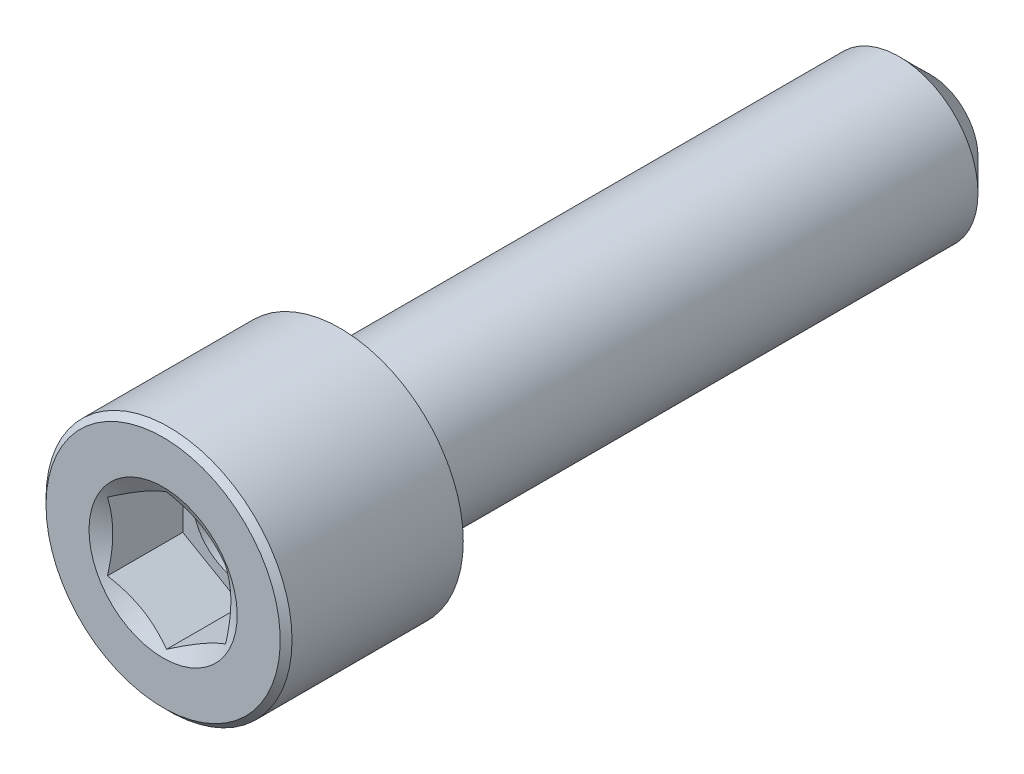
ISO-10303-21;
HEADER;
FILE_DESCRIPTION(('STEP AP214'),'2;1');
FILE_NAME('part.step','',(''),(''),'','','');
FILE_SCHEMA(('AUTOMOTIVE_DESIGN { 1 0 10303 214 1 1 1 1 }'));
ENDSEC;
DATA;
#1=APPLICATION_CONTEXT('core data for automotive mechanical design processes');
#2=APPLICATION_PROTOCOL_DEFINITION('international standard','automotive_design',2000,#1);
#3=PRODUCT_CONTEXT('',#1,'mechanical');
#4=PRODUCT('Part','Part','',(#3));
#5=PRODUCT_RELATED_PRODUCT_CATEGORY('part','',(#4));
#6=PRODUCT_DEFINITION_FORMATION('','',#4);
#7=PRODUCT_DEFINITION_CONTEXT('part definition',#1,'design');
#8=PRODUCT_DEFINITION('design','',#6,#7);
#9=PRODUCT_DEFINITION_SHAPE('','',#8);
#10=(LENGTH_UNIT() NAMED_UNIT(*) SI_UNIT(.MILLI.,.METRE.));
#11=(NAMED_UNIT(*) PLANE_ANGLE_UNIT() SI_UNIT($,.RADIAN.));
#12=(NAMED_UNIT(*) SI_UNIT($,.STERADIAN.) SOLID_ANGLE_UNIT());
#13=UNCERTAINTY_MEASURE_WITH_UNIT(LENGTH_MEASURE(1.E-05),#10,'distance_accuracy_value','');
#14=(GEOMETRIC_REPRESENTATION_CONTEXT(3) GLOBAL_UNCERTAINTY_ASSIGNED_CONTEXT((#13)) GLOBAL_UNIT_ASSIGNED_CONTEXT((#10,
#11,#12)) REPRESENTATION_CONTEXT('',''));
#15=CARTESIAN_POINT('',(0.,0.,0.));
#16=DIRECTION('',(0.,0.,1.));
#17=DIRECTION('',(1.,0.,0.));
#18=AXIS2_PLACEMENT_3D('',#15,#16,#17);
#19=CARTESIAN_POINT('',(0.,0.,-21.7925762462331));
#20=DIRECTION('',(0.,0.,1.));
#21=DIRECTION('',(1.,0.,0.));
#22=AXIS2_PLACEMENT_3D('',#19,#20,#21);
#23=PLANE('',#22);
#24=CARTESIAN_POINT('',(0.,0.,-21.7925762462331));
#25=DIRECTION('',(0.,0.,1.));
#26=DIRECTION('',(1.,0.,0.));
#27=AXIS2_PLACEMENT_3D('',#24,#25,#26);
#28=CIRCLE('',#27,2.4);
#29=CARTESIAN_POINT('',(2.39999999999999,0.,-21.7925762462331));
#30=VERTEX_POINT('',#29);
#31=EDGE_CURVE('E163',#30,#30,#28,.F.);
#32=ORIENTED_EDGE('',*,*,#31,.T.);
#33=EDGE_LOOP('',(#32));
#34=FACE_BOUND('',#33,.T.);
#35=ADVANCED_FACE('F49',(#34),#23,.F.);
#36=CARTESIAN_POINT('',(0.,0.,17.2074237537669));
#37=DIRECTION('',(0.,0.,1.));
#38=DIRECTION('',(1.,0.,0.));
#39=AXIS2_PLACEMENT_3D('',#36,#37,#38);
#40=CYLINDRICAL_SURFACE('',#39,4.);
#41=CARTESIAN_POINT('',(0.,0.,7.70742375376693));
#42=DIRECTION('',(0.,0.,1.));
#43=DIRECTION('',(1.,0.,0.));
#44=AXIS2_PLACEMENT_3D('',#41,#42,#43);
#45=CIRCLE('',#44,4.);
#46=CARTESIAN_POINT('',(4.,0.,7.70742375376693));
#47=VERTEX_POINT('',#46);
#48=EDGE_CURVE('E64',#47,#47,#45,.F.);
#49=ORIENTED_EDGE('',*,*,#48,.T.);
#50=EDGE_LOOP('',(#49));
#51=FACE_BOUND('',#50,.T.);
#52=CARTESIAN_POINT('',(0.,0.,-20.1925762462331));
#53=DIRECTION('',(0.,0.,1.));
#54=DIRECTION('',(1.,0.,0.));
#55=AXIS2_PLACEMENT_3D('',#52,#53,#54);
#56=CIRCLE('',#55,4.);
#57=CARTESIAN_POINT('',(4.,0.,-20.1925762462331));
#58=VERTEX_POINT('',#57);
#59=EDGE_CURVE('E169',#58,#58,#56,.T.);
#60=ORIENTED_EDGE('',*,*,#59,.T.);
#61=EDGE_LOOP('',(#60));
#62=FACE_BOUND('',#61,.T.);
#63=ADVANCED_FACE('F124',(#51,#62),#40,.T.);
#64=CARTESIAN_POINT('',(0.,4.,8.20742375376693));
#65=DIRECTION('',(0.,0.,1.));
#66=DIRECTION('',(1.,0.,0.));
#67=AXIS2_PLACEMENT_3D('',#64,#65,#66);
#68=PLANE('',#67);
#69=CARTESIAN_POINT('',(0.,0.,8.20742375376693));
#70=DIRECTION('',(0.,0.,1.));
#71=DIRECTION('',(1.,0.,0.));
#72=AXIS2_PLACEMENT_3D('',#69,#70,#71);
#73=CIRCLE('',#72,4.5);
#74=CARTESIAN_POINT('',(4.5,0.,8.20742375376693));
#75=VERTEX_POINT('',#74);
#76=EDGE_CURVE('E167',#75,#75,#73,.T.);
#77=ORIENTED_EDGE('',*,*,#76,.T.);
#78=EDGE_LOOP('',(#77));
#79=FACE_BOUND('',#78,.T.);
#80=CARTESIAN_POINT('',(0.,0.,8.20742375376693));
#81=DIRECTION('',(0.,0.,1.));
#82=DIRECTION('',(1.,0.,0.));
#83=AXIS2_PLACEMENT_3D('',#80,#81,#82);
#84=CIRCLE('',#83,6.25);
#85=CARTESIAN_POINT('',(6.25,0.,8.20742375376693));
#86=VERTEX_POINT('',#85);
#87=EDGE_CURVE('E187',#86,#86,#84,.T.);
#88=ORIENTED_EDGE('',*,*,#87,.F.);
#89=EDGE_LOOP('',(#88));
#90=FACE_BOUND('',#89,.T.);
#91=ADVANCED_FACE('F130',(#79,#90),#68,.F.);
#92=CARTESIAN_POINT('',(0.,0.,17.2074237537669));
#93=DIRECTION('',(0.,0.,1.));
#94=DIRECTION('',(1.,0.,0.));
#95=AXIS2_PLACEMENT_3D('',#92,#93,#94);
#96=CYLINDRICAL_SURFACE('',#95,6.25);
#97=CARTESIAN_POINT('',(0.,0.,16.9074237537669));
#98=DIRECTION('',(0.,0.,-1.));
#99=DIRECTION('',(-1.,0.,0.));
#100=AXIS2_PLACEMENT_3D('',#97,#98,#99);
#101=CIRCLE('',#100,6.25);
#102=CARTESIAN_POINT('',(-6.25,0.,16.9074237537669));
#103=VERTEX_POINT('',#102);
#104=EDGE_CURVE('E157',#103,#103,#101,.T.);
#105=ORIENTED_EDGE('',*,*,#104,.T.);
#106=EDGE_LOOP('',(#105));
#107=FACE_BOUND('',#106,.T.);
#108=ORIENTED_EDGE('',*,*,#87,.T.);
#109=EDGE_LOOP('',(#108));
#110=FACE_BOUND('',#109,.T.);
#111=ADVANCED_FACE('F184',(#107,#110),#96,.T.);
#112=CARTESIAN_POINT('',(0.,6.25,17.2074237537669));
#113=DIRECTION('',(0.,0.,-1.));
#114=DIRECTION('',(-1.,0.,0.));
#115=AXIS2_PLACEMENT_3D('',#112,#113,#114);
#116=PLANE('',#115);
#117=CARTESIAN_POINT('',(0.,0.,17.2074237537669));
#118=DIRECTION('',(0.,0.,1.));
#119=DIRECTION('',(0.,-1.,0.));
#120=AXIS2_PLACEMENT_3D('',#117,#118,#119);
#121=CIRCLE('',#120,3.76410161513775);
#122=CARTESIAN_POINT('',(0.,-3.76410161513775,17.2074237537669));
#123=VERTEX_POINT('',#122);
#124=EDGE_CURVE('E321',#123,#123,#121,.T.);
#125=ORIENTED_EDGE('',*,*,#124,.F.);
#126=EDGE_LOOP('',(#125));
#127=FACE_BOUND('',#126,.T.);
#128=CARTESIAN_POINT('',(0.,0.,17.2074237537669));
#129=DIRECTION('',(0.,0.,-1.));
#130=DIRECTION('',(-1.,0.,0.));
#131=AXIS2_PLACEMENT_3D('',#128,#129,#130);
#132=CIRCLE('',#131,5.95);
#133=CARTESIAN_POINT('',(-5.95,0.,17.2074237537669));
#134=VERTEX_POINT('',#133);
#135=EDGE_CURVE('E160',#134,#134,#132,.F.);
#136=ORIENTED_EDGE('',*,*,#135,.T.);
#137=EDGE_LOOP('',(#136));
#138=FACE_BOUND('',#137,.T.);
#139=ADVANCED_FACE('F143',(#127,#138),#116,.F.);
#140=CARTESIAN_POINT('',(0.,0.,-20.1925762462331));
#141=DIRECTION('',(0.,0.,1.));
#142=DIRECTION('',(1.,0.,0.));
#143=AXIS2_PLACEMENT_3D('',#140,#141,#142);
#144=CONICAL_SURFACE('',#143,4.,0.78539816339745);
#145=CARTESIAN_POINT('',(2.39999999999999,0.,-21.7925762462331));
#146=CARTESIAN_POINT('',(2.41666666666666,0.,-21.7759095795664));
#147=CARTESIAN_POINT('',(2.43333333333333,0.,-21.7592429128997));
#148=CARTESIAN_POINT('',(2.46666666666666,0.,-21.7259095795664));
#149=CARTESIAN_POINT('',(2.48333333333333,0.,-21.7092429128997));
#150=CARTESIAN_POINT('',(2.51666666666666,0.,-21.6759095795664));
#151=CARTESIAN_POINT('',(2.53333333333333,0.,-21.6592429128997));
#152=CARTESIAN_POINT('',(2.56666666666666,0.,-21.6259095795664));
#153=CARTESIAN_POINT('',(2.58333333333333,0.,-21.6092429128997));
#154=CARTESIAN_POINT('',(2.61666666666666,0.,-21.5759095795664));
#155=CARTESIAN_POINT('',(2.63333333333333,0.,-21.5592429128997));
#156=CARTESIAN_POINT('',(2.66666666666666,0.,-21.5259095795664));
#157=CARTESIAN_POINT('',(2.68333333333333,0.,-21.5092429128997));
#158=CARTESIAN_POINT('',(2.71666666666666,0.,-21.4759095795664));
#159=CARTESIAN_POINT('',(2.73333333333333,0.,-21.4592429128997));
#160=CARTESIAN_POINT('',(2.76666666666666,0.,-21.4259095795664));
#161=CARTESIAN_POINT('',(2.78333333333333,0.,-21.4092429128997));
#162=CARTESIAN_POINT('',(2.81666666666666,0.,-21.3759095795664));
#163=CARTESIAN_POINT('',(2.83333333333333,0.,-21.3592429128997));
#164=CARTESIAN_POINT('',(2.86666666666666,0.,-21.3259095795664));
#165=CARTESIAN_POINT('',(2.88333333333333,0.,-21.3092429128997));
#166=CARTESIAN_POINT('',(2.91666666666666,0.,-21.2759095795664));
#167=CARTESIAN_POINT('',(2.93333333333333,0.,-21.2592429128997));
#168=CARTESIAN_POINT('',(2.96666666666666,0.,-21.2259095795664));
#169=CARTESIAN_POINT('',(2.98333333333333,0.,-21.2092429128997));
#170=CARTESIAN_POINT('',(3.01666666666666,0.,-21.1759095795664));
#171=CARTESIAN_POINT('',(3.03333333333333,0.,-21.1592429128997));
#172=CARTESIAN_POINT('',(3.06666666666666,0.,-21.1259095795664));
#173=CARTESIAN_POINT('',(3.08333333333333,0.,-21.1092429128997));
#174=CARTESIAN_POINT('',(3.11666666666666,0.,-21.0759095795664));
#175=CARTESIAN_POINT('',(3.13333333333333,0.,-21.0592429128997));
#176=CARTESIAN_POINT('',(3.16666666666666,0.,-21.0259095795664));
#177=CARTESIAN_POINT('',(3.18333333333333,0.,-21.0092429128997));
#178=CARTESIAN_POINT('',(3.21666666666666,0.,-20.9759095795664));
#179=CARTESIAN_POINT('',(3.23333333333333,0.,-20.9592429128997));
#180=CARTESIAN_POINT('',(3.26666666666666,0.,-20.9259095795664));
#181=CARTESIAN_POINT('',(3.28333333333333,0.,-20.9092429128997));
#182=CARTESIAN_POINT('',(3.31666666666666,0.,-20.8759095795664));
#183=CARTESIAN_POINT('',(3.33333333333333,0.,-20.8592429128997));
#184=CARTESIAN_POINT('',(3.36666666666666,0.,-20.8259095795664));
#185=CARTESIAN_POINT('',(3.38333333333333,0.,-20.8092429128997));
#186=CARTESIAN_POINT('',(3.41666666666666,0.,-20.7759095795664));
#187=CARTESIAN_POINT('',(3.43333333333333,0.,-20.7592429128997));
#188=CARTESIAN_POINT('',(3.46666666666666,0.,-20.7259095795664));
#189=CARTESIAN_POINT('',(3.48333333333333,0.,-20.7092429128997));
#190=CARTESIAN_POINT('',(3.51666666666666,0.,-20.6759095795664));
#191=CARTESIAN_POINT('',(3.53333333333333,0.,-20.6592429128997));
#192=CARTESIAN_POINT('',(3.56666666666666,0.,-20.6259095795664));
#193=CARTESIAN_POINT('',(3.58333333333333,0.,-20.6092429128997));
#194=CARTESIAN_POINT('',(3.61666666666666,0.,-20.5759095795664));
#195=CARTESIAN_POINT('',(3.63333333333333,0.,-20.5592429128997));
#196=CARTESIAN_POINT('',(3.66666666666666,0.,-20.5259095795664));
#197=CARTESIAN_POINT('',(3.68333333333333,0.,-20.5092429128997));
#198=CARTESIAN_POINT('',(3.71666666666666,0.,-20.4759095795664));
#199=CARTESIAN_POINT('',(3.73333333333333,0.,-20.4592429128997));
#200=CARTESIAN_POINT('',(3.76666666666666,0.,-20.4259095795664));
#201=CARTESIAN_POINT('',(3.78333333333333,0.,-20.4092429128997));
#202=CARTESIAN_POINT('',(3.81666666666666,0.,-20.3759095795664));
#203=CARTESIAN_POINT('',(3.83333333333333,0.,-20.3592429128997));
#204=CARTESIAN_POINT('',(3.86666666666666,0.,-20.3259095795664));
#205=CARTESIAN_POINT('',(3.88333333333333,0.,-20.3092429128997));
#206=CARTESIAN_POINT('',(3.91666666666666,0.,-20.2759095795664));
#207=CARTESIAN_POINT('',(3.93333333333333,0.,-20.2592429128997));
#208=CARTESIAN_POINT('',(3.96666666666666,0.,-20.2259095795664));
#209=CARTESIAN_POINT('',(3.98333333333333,0.,-20.2092429128997));
#210=CARTESIAN_POINT('',(4.,0.,-20.1925762462331));
#211=B_SPLINE_CURVE_WITH_KNOTS('',3,(#145,#146,#147,#148,#149,#150,#151,#152,#153,#154,#155,
#156,#157,#158,#159,#160,#161,#162,#163,#164,#165,#166,#167,#168,#169,#170,#171,#172,#173,#174,
#175,#176,#177,#178,#179,#180,#181,#182,#183,#184,#185,#186,#187,#188,#189,#190,#191,#192,#193,
#194,#195,#196,#197,#198,#199,#200,#201,#202,#203,#204,#205,#206,#207,#208,#209,#210),
.UNSPECIFIED.,.F.,.F.,(4,2,2,2,2,2,2,2,2,2,2,2,2,2,2,2,2,2,2,2,2,2,2,2,2,2,2,2,2,2,2,2,4),(0.,
0.0707106781186556,0.141421356237311,0.212132034355965,0.282842712474621,0.353553390593274,
0.42426406871193,0.494974746830583,0.565685424949239,0.636396103067895,0.707106781186548,
0.777817459305204,0.848528137423858,0.919238815542513,0.989949493661167,1.06066017177982,
1.13137084989848,1.20208152801713,1.27279220613579,1.34350288425444,1.4142135623731,
1.48492424049175,1.55563491861041,1.62634559672906,1.69705627484772,1.76776695296637,
1.83847763108502,1.90918830920368,1.97989898732233,2.05060966544099,2.12132034355964,
2.1920310216783,2.26274169979696),.UNSPECIFIED.);
#212=EDGE_CURVE('BSEAM137',#30,#58,#211,.T.);
#213=ORIENTED_EDGE('',*,*,#31,.F.);
#214=ORIENTED_EDGE('',*,*,#59,.F.);
#215=ORIENTED_EDGE('',*,*,#212,.T.);
#216=ORIENTED_EDGE('',*,*,#212,.F.);
#217=EDGE_LOOP('',(#213,#215,#214,#216));
#218=FACE_BOUND('',#217,.T.);
#219=ADVANCED_FACE('F137',(#218),#144,.T.);
#220=CARTESIAN_POINT('',(0.,0.,17.2074237537669));
#221=DIRECTION('',(0.,0.,-1.));
#222=DIRECTION('',(-1.,0.,0.));
#223=AXIS2_PLACEMENT_3D('',#220,#221,#222);
#224=CONICAL_SURFACE('',#223,5.95,0.785398163397453);
#225=ORIENTED_EDGE('',*,*,#104,.F.);
#226=EDGE_LOOP('',(#225));
#227=FACE_BOUND('',#226,.T.);
#228=ORIENTED_EDGE('',*,*,#135,.F.);
#229=EDGE_LOOP('',(#228));
#230=FACE_BOUND('',#229,.T.);
#231=ADVANCED_FACE('F142',(#227,#230),#224,.T.);
#232=CARTESIAN_POINT('',(0.,0.,7.70742375376693));
#233=DIRECTION('',(0.,0.,1.));
#234=DIRECTION('',(1.,0.,0.));
#235=AXIS2_PLACEMENT_3D('',#232,#233,#234);
#236=TOROIDAL_SURFACE('',#235,4.5,0.5);
#237=ORIENTED_EDGE('',*,*,#48,.F.);
#238=EDGE_LOOP('',(#237));
#239=FACE_BOUND('',#238,.T.);
#240=ORIENTED_EDGE('',*,*,#76,.F.);
#241=EDGE_LOOP('',(#240));
#242=FACE_BOUND('',#241,.T.);
#243=ADVANCED_FACE('F51',(#239,#242),#236,.F.);
#244=CARTESIAN_POINT('',(0.,0.,16.03421867301));
#245=DIRECTION('',(0.,0.,1.));
#246=DIRECTION('',(0.,-1.,0.));
#247=AXIS2_PLACEMENT_3D('',#244,#245,#246);
#248=CONICAL_SURFACE('',#247,1.73205080756888,1.0471975511966);
#249=ORIENTED_EDGE('',*,*,#124,.T.);
#250=EDGE_LOOP('',(#249));
#251=FACE_BOUND('',#250,.T.);
#252=CARTESIAN_POINT('',(-0.000200000000001688,3.46421708519159,17.0342853430099));
#253=CARTESIAN_POINT('',(0.13163520658833,3.38810199317915,16.9903231850312));
#254=CARTESIAN_POINT('',(0.264608405355248,3.31132988107606,16.9503410668716));
#255=CARTESIAN_POINT('',(0.532857420002055,3.15645624025988,16.8805515610244));
#256=CARTESIAN_POINT('',(0.668138002634341,3.078351959461,16.8507688628443));
#257=CARTESIAN_POINT('',(0.937022602096482,2.92311136358059,16.8044073197902));
#258=CARTESIAN_POINT('',(1.07058524542946,2.84599893549861,16.7875199217019));
#259=CARTESIAN_POINT('',(1.33833905729569,2.6914112001411,16.7673591230274));
#260=CARTESIAN_POINT('',(1.47252925247984,2.61393645482892,16.76406902836));
#261=CARTESIAN_POINT('',(1.72327559769581,2.46916798492017,16.7709100114643));
#262=CARTESIAN_POINT('',(1.83986926497267,2.40185259973206,16.7793613947715));
#263=CARTESIAN_POINT('',(2.07229698497464,2.2676603930218,16.806148423586));
#264=CARTESIAN_POINT('',(2.18813023365133,2.2007840357172,16.8244932214406));
#265=CARTESIAN_POINT('',(2.42103725705637,2.06631510305815,16.8703542314322));
#266=CARTESIAN_POINT('',(2.53808155051394,1.99873954872331,16.898064865842));
#267=CARTESIAN_POINT('',(2.77042435049912,1.86459637060759,16.9609572757163));
#268=CARTESIAN_POINT('',(2.88572583417111,1.79802702797161,16.9961242716005));
#269=CARTESIAN_POINT('',(3.0002,1.73193533751504,17.0342853430099));
#270=B_SPLINE_CURVE_WITH_KNOTS('',3,(#252,#253,#254,#255,#256,#257,#258,#259,#260,#261,#262,
#263,#264,#265,#266,#267,#268,#269),.UNSPECIFIED.,.F.,.F.,(4,2,2,2,2,2,2,2,4),(0.,
0.475539830103042,0.952222784107965,1.41710776961288,1.88142182298026,2.28572436316091,
2.69040156475039,3.10405572063576,3.5168974940707),.UNSPECIFIED.);
#271=CARTESIAN_POINT('',(0.,3.46410161513776,17.03421867301));
#272=VERTEX_POINT('',#271);
#273=CARTESIAN_POINT('',(3.,1.73205080756966,17.0342186730096));
#274=VERTEX_POINT('',#273);
#275=EDGE_CURVE('E240',#272,#274,#270,.T.);
#276=ORIENTED_EDGE('',*,*,#275,.T.);
#277=CARTESIAN_POINT('',(3.,5.38962830538255,18.5954962186005));
#278=CARTESIAN_POINT('',(3.,5.26173740516624,18.5309892800224));
#279=CARTESIAN_POINT('',(3.,5.13363387593006,18.4668996977853));
#280=CARTESIAN_POINT('',(3.,4.8769076841812,18.3397605178634));
#281=CARTESIAN_POINT('',(3.,4.74828500734886,18.2767109491128));
#282=CARTESIAN_POINT('',(3.,4.49018876919909,18.1517420610283));
#283=CARTESIAN_POINT('',(3.,4.36071405549711,18.0898251168979));
#284=CARTESIAN_POINT('',(3.,4.10103827049095,17.9675256649622));
#285=CARTESIAN_POINT('',(3.,3.97083718828899,17.9071431802546));
#286=CARTESIAN_POINT('',(3.,3.7033977456151,17.7854642347925));
#287=CARTESIAN_POINT('',(3.,3.56611756276077,17.7242594026757));
#288=CARTESIAN_POINT('',(3.,3.29041889481005,17.6044723645682));
#289=CARTESIAN_POINT('',(3.,3.15200044707277,17.5458900729064));
#290=CARTESIAN_POINT('',(3.,2.87389204464994,17.4321087038346));
#291=CARTESIAN_POINT('',(3.,2.73420311594281,17.3769071342519));
#292=CARTESIAN_POINT('',(3.,2.45315802907679,17.2707847234612));
#293=CARTESIAN_POINT('',(3.,2.31180143635784,17.2198650274328));
#294=CARTESIAN_POINT('',(3.,1.9967113272517,17.1132592342373));
#295=CARTESIAN_POINT('',(3.,1.82252524878934,17.0588865789683));
#296=CARTESIAN_POINT('',(3.,1.47111129921213,16.9612610161865));
#297=CARTESIAN_POINT('',(3.,1.29388521799238,16.918001789857));
#298=CARTESIAN_POINT('',(3.,0.939484629515729,16.8467367392009));
#299=CARTESIAN_POINT('',(3.,0.762363221635396,16.8184778403726));
#300=CARTESIAN_POINT('',(3.,0.495308220999028,16.7889888122446));
#301=CARTESIAN_POINT('',(3.,0.406065589591795,16.7813090847365));
#302=CARTESIAN_POINT('',(3.,0.227310511889202,16.7704774773063));
#303=CARTESIAN_POINT('',(3.,0.137798102860536,16.7673249983588));
#304=CARTESIAN_POINT('',(3.,-0.0419927126939883,16.7656555197511));
#305=CARTESIAN_POINT('',(3.,-0.132271475241786,16.7671761067044));
#306=CARTESIAN_POINT('',(3.,-0.312623707590833,16.774872795197));
#307=CARTESIAN_POINT('',(3.,-0.402697175799083,16.7810489327389));
#308=CARTESIAN_POINT('',(3.,-0.672336938591248,16.8062866499634));
#309=CARTESIAN_POINT('',(3.,-0.851300421523274,16.8320576642321));
#310=CARTESIAN_POINT('',(3.,-1.20953526816042,16.8991213090178));
#311=CARTESIAN_POINT('',(3.,-1.38875300524909,16.9406877794714));
#312=CARTESIAN_POINT('',(3.,-1.74399100989388,17.0356085310117));
#313=CARTESIAN_POINT('',(3.,-1.92001094125292,17.0889640438509));
#314=CARTESIAN_POINT('',(3.,-2.24046809062631,17.1948825876832));
#315=CARTESIAN_POINT('',(3.,-2.38534606501975,17.2461376137308));
#316=CARTESIAN_POINT('',(3.,-2.67337117238236,17.3533268449299));
#317=CARTESIAN_POINT('',(3.,-2.81651808709219,17.4092616332284));
#318=CARTESIAN_POINT('',(3.,-3.10142959874094,17.524772792179));
#319=CARTESIAN_POINT('',(3.,-3.24319327311719,17.5843514231399));
#320=CARTESIAN_POINT('',(3.,-3.5255059246989,17.7063232732363));
#321=CARTESIAN_POINT('',(3.,-3.66605485700159,17.7687165958908));
#322=CARTESIAN_POINT('',(3.,-3.93966874363035,17.8927823700233));
#323=CARTESIAN_POINT('',(3.,-4.07277923375134,17.9543547395614));
#324=CARTESIAN_POINT('',(3.,-4.33823787201148,18.0791254605474));
#325=CARTESIAN_POINT('',(3.,-4.47058600430111,18.1423238456521));
#326=CARTESIAN_POINT('',(3.,-4.73436013292436,18.2699039922892));
#327=CARTESIAN_POINT('',(3.,-4.8657874960322,18.3342829339957));
#328=CARTESIAN_POINT('',(3.,-5.12809319476855,18.4641284400156));
#329=CARTESIAN_POINT('',(3.,-5.25897156682274,18.529594930693));
#330=CARTESIAN_POINT('',(3.,-5.38962830538255,18.5954962186005));
#331=B_SPLINE_CURVE_WITH_KNOTS('',3,(#277,#278,#279,#280,#281,#282,#283,#284,#285,#286,#287,
#288,#289,#290,#291,#292,#293,#294,#295,#296,#297,#298,#299,#300,#301,#302,#303,#304,#305,#306,
#307,#308,#309,#310,#311,#312,#313,#314,#315,#316,#317,#318,#319,#320,#321,#322,#323,#324,#325,
#326,#327,#328,#329,#330),.UNSPECIFIED.,.F.,.F.,(4,2,2,2,2,2,2,2,2,2,2,2,2,2,2,2,2,2,2,2,2,2,2,
2,2,2,4),(0.,0.429717130035162,0.859446195093511,1.2899917832156,1.72054384832554,
2.17144006765624,2.62232154667326,3.07286654543092,3.52353166094266,4.07067968371202,
4.61751591987665,5.15480687241636,5.42342536576059,5.69200831342277,5.96275717752666,
6.23350813542493,6.77507624835236,7.32649655285842,7.87797449858097,8.3389136666793,
8.79991035838371,9.26119596933361,9.72249855933234,10.1624696483861,10.6024498517182,
11.0414891096709,11.4804987612806),.UNSPECIFIED.);
#332=CARTESIAN_POINT('',(3.,-1.73205080756888,17.03421867301));
#333=VERTEX_POINT('',#332);
#334=EDGE_CURVE('E248',#274,#333,#331,.T.);
#335=ORIENTED_EDGE('',*,*,#334,.T.);
#336=CARTESIAN_POINT('',(3.0002,-1.73193533751504,17.0342853430099));
#337=CARTESIAN_POINT('',(2.86836479341167,-1.80805042952749,16.9903231850312));
#338=CARTESIAN_POINT('',(2.73539159464475,-1.88482254163057,16.9503410668716));
#339=CARTESIAN_POINT('',(2.46714257999794,-2.03969618244676,16.8805515610244));
#340=CARTESIAN_POINT('',(2.33186199736566,-2.11780046324564,16.8507688628443));
#341=CARTESIAN_POINT('',(2.06297739790352,-2.27304105912605,16.8044073197902));
#342=CARTESIAN_POINT('',(1.92941475457054,-2.35015348720802,16.7875199217019));
#343=CARTESIAN_POINT('',(1.66166094270431,-2.50474122256554,16.7673591230274));
#344=CARTESIAN_POINT('',(1.52747074752016,-2.58221596787772,16.76406902836));
#345=CARTESIAN_POINT('',(1.27672440230419,-2.72698443778647,16.7709100114643));
#346=CARTESIAN_POINT('',(1.16013073502732,-2.79429982297457,16.7793613947715));
#347=CARTESIAN_POINT('',(0.927703015025362,-2.92849202968484,16.806148423586));
#348=CARTESIAN_POINT('',(0.811869766348668,-2.99536838698943,16.8244932214406));
#349=CARTESIAN_POINT('',(0.578962742943632,-3.12983731964849,16.8703542314323));
#350=CARTESIAN_POINT('',(0.461918449486059,-3.19741287398333,16.898064865842));
#351=CARTESIAN_POINT('',(0.229575649500876,-3.33155605209904,16.9609572757163));
#352=CARTESIAN_POINT('',(0.114274165828894,-3.39812539473502,16.9961242716005));
#353=CARTESIAN_POINT('',(-0.000200000000001111,-3.46421708519159,17.0342853430099));
#354=B_SPLINE_CURVE_WITH_KNOTS('',3,(#336,#337,#338,#339,#340,#341,#342,#343,#344,#345,#346,
#347,#348,#349,#350,#351,#352,#353),.UNSPECIFIED.,.F.,.F.,(4,2,2,2,2,2,2,2,4),(0.,
0.475539830103041,0.952222784107963,1.41710776961288,1.88142182298026,2.28572436316091,
2.69040156475039,3.10405572063576,3.5168974940707),.UNSPECIFIED.);
#355=CARTESIAN_POINT('',(0.,-3.46410161513776,17.03421867301));
#356=VERTEX_POINT('',#355);
#357=EDGE_CURVE('E281',#333,#356,#354,.T.);
#358=ORIENTED_EDGE('',*,*,#357,.T.);
#359=CARTESIAN_POINT('',(0.000199999999999026,-3.46421708519159,17.0342853430099));
#360=CARTESIAN_POINT('',(-0.131635206588334,-3.38810199317915,16.9903231850312));
#361=CARTESIAN_POINT('',(-0.264608405355251,-3.31132988107607,16.9503410668716));
#362=CARTESIAN_POINT('',(-0.532857420002057,-3.15645624025988,16.8805515610244));
#363=CARTESIAN_POINT('',(-0.668138002634342,-3.078351959461,16.8507688628443));
#364=CARTESIAN_POINT('',(-0.937022602096484,-2.92311136358059,16.8044073197902));
#365=CARTESIAN_POINT('',(-1.07058524542946,-2.84599893549862,16.7875199217019));
#366=CARTESIAN_POINT('',(-1.33833905729569,-2.6914112001411,16.7673591230275));
#367=CARTESIAN_POINT('',(-1.47252925247984,-2.61393645482892,16.76406902836));
#368=CARTESIAN_POINT('',(-1.72327559769581,-2.46916798492017,16.7709100114643));
#369=CARTESIAN_POINT('',(-1.83986926497268,-2.40185259973206,16.7793613947715));
#370=CARTESIAN_POINT('',(-2.07229698497464,-2.2676603930218,16.806148423586));
#371=CARTESIAN_POINT('',(-2.18813023365133,-2.2007840357172,16.8244932214406));
#372=CARTESIAN_POINT('',(-2.42103725705637,-2.06631510305815,16.8703542314322));
#373=CARTESIAN_POINT('',(-2.53808155051394,-1.99873954872331,16.898064865842));
#374=CARTESIAN_POINT('',(-2.77042435049913,-1.86459637060759,16.9609572757163));
#375=CARTESIAN_POINT('',(-2.88572583417111,-1.79802702797161,16.9961242716005));
#376=CARTESIAN_POINT('',(-3.0002,-1.73193533751504,17.0342853430099));
#377=B_SPLINE_CURVE_WITH_KNOTS('',3,(#359,#360,#361,#362,#363,#364,#365,#366,#367,#368,#369,
#370,#371,#372,#373,#374,#375,#376),.UNSPECIFIED.,.F.,.F.,(4,2,2,2,2,2,2,2,4),(0.,
0.475539830103041,0.952222784107963,1.41710776961288,1.88142182298026,2.28572436316091,
2.69040156475039,3.10405572063576,3.5168974940707),.UNSPECIFIED.);
#378=CARTESIAN_POINT('',(-3.,-1.73205080756966,17.0342186730096));
#379=VERTEX_POINT('',#378);
#380=EDGE_CURVE('E275',#356,#379,#377,.T.);
#381=ORIENTED_EDGE('',*,*,#380,.T.);
#382=CARTESIAN_POINT('',(-3.,-5.38962830538255,18.5954962186005));
#383=CARTESIAN_POINT('',(-3.,-5.26173740516624,18.5309892800224));
#384=CARTESIAN_POINT('',(-3.,-5.13363387593006,18.4668996977853));
#385=CARTESIAN_POINT('',(-3.,-4.8769076841812,18.3397605178634));
#386=CARTESIAN_POINT('',(-3.,-4.74828500734886,18.2767109491128));
#387=CARTESIAN_POINT('',(-3.,-4.49018876919908,18.1517420610283));
#388=CARTESIAN_POINT('',(-3.,-4.3607140554971,18.0898251168979));
#389=CARTESIAN_POINT('',(-3.,-4.10103827049095,17.9675256649622));
#390=CARTESIAN_POINT('',(-3.,-3.97083718828899,17.9071431802546));
#391=CARTESIAN_POINT('',(-3.,-3.70339774561509,17.7854642347925));
#392=CARTESIAN_POINT('',(-3.,-3.56611756276077,17.7242594026757));
#393=CARTESIAN_POINT('',(-3.,-3.29041889481004,17.6044723645682));
#394=CARTESIAN_POINT('',(-3.,-3.15200044707277,17.5458900729064));
#395=CARTESIAN_POINT('',(-3.,-2.87389204464994,17.4321087038346));
#396=CARTESIAN_POINT('',(-3.,-2.73420311594281,17.3769071342519));
#397=CARTESIAN_POINT('',(-3.,-2.45315802907678,17.2707847234612));
#398=CARTESIAN_POINT('',(-3.,-2.31180143635783,17.2198650274328));
#399=CARTESIAN_POINT('',(-3.,-1.9967113272517,17.1132592342373));
#400=CARTESIAN_POINT('',(-3.,-1.82252524878933,17.0588865789683));
#401=CARTESIAN_POINT('',(-3.,-1.47111129921213,16.9612610161865));
#402=CARTESIAN_POINT('',(-3.,-1.29388521799237,16.918001789857));
#403=CARTESIAN_POINT('',(-3.,-0.939484629515724,16.8467367392009));
#404=CARTESIAN_POINT('',(-3.,-0.762363221635391,16.8184778403726));
#405=CARTESIAN_POINT('',(-3.,-0.495308220999024,16.7889888122446));
#406=CARTESIAN_POINT('',(-3.,-0.406065589591791,16.7813090847365));
#407=CARTESIAN_POINT('',(-3.,-0.227310511889198,16.7704774773063));
#408=CARTESIAN_POINT('',(-3.,-0.137798102860532,16.7673249983588));
#409=CARTESIAN_POINT('',(-3.,0.0419927126939932,16.7656555197511));
#410=CARTESIAN_POINT('',(-3.,0.132271475241791,16.7671761067044));
#411=CARTESIAN_POINT('',(-3.,0.312623707590837,16.774872795197));
#412=CARTESIAN_POINT('',(-3.,0.402697175799088,16.7810489327389));
#413=CARTESIAN_POINT('',(-3.,0.672336938591254,16.8062866499634));
#414=CARTESIAN_POINT('',(-3.,0.851300421523279,16.8320576642321));
#415=CARTESIAN_POINT('',(-3.,1.20953526816042,16.8991213090178));
#416=CARTESIAN_POINT('',(-3.,1.3887530052491,16.9406877794714));
#417=CARTESIAN_POINT('',(-3.,1.74399100989388,17.0356085310117));
#418=CARTESIAN_POINT('',(-3.,1.92001094125292,17.0889640438509));
#419=CARTESIAN_POINT('',(-3.,2.24046809062632,17.1948825876832));
#420=CARTESIAN_POINT('',(-3.,2.38534606501975,17.2461376137308));
#421=CARTESIAN_POINT('',(-3.,2.67337117238237,17.3533268449299));
#422=CARTESIAN_POINT('',(-3.,2.8165180870922,17.4092616332284));
#423=CARTESIAN_POINT('',(-3.,3.10142959874094,17.524772792179));
#424=CARTESIAN_POINT('',(-3.,3.24319327311719,17.5843514231399));
#425=CARTESIAN_POINT('',(-3.,3.5255059246989,17.7063232732363));
#426=CARTESIAN_POINT('',(-3.,3.66605485700159,17.7687165958908));
#427=CARTESIAN_POINT('',(-3.,3.93966874363035,17.8927823700233));
#428=CARTESIAN_POINT('',(-3.,4.07277923375134,17.9543547395614));
#429=CARTESIAN_POINT('',(-3.,4.33823787201148,18.0791254605474));
#430=CARTESIAN_POINT('',(-3.,4.47058600430111,18.1423238456521));
#431=CARTESIAN_POINT('',(-3.,4.73436013292436,18.2699039922892));
#432=CARTESIAN_POINT('',(-3.,4.8657874960322,18.3342829339957));
#433=CARTESIAN_POINT('',(-3.,5.12809319476854,18.4641284400156));
#434=CARTESIAN_POINT('',(-3.,5.25897156682273,18.529594930693));
#435=CARTESIAN_POINT('',(-3.,5.38962830538255,18.5954962186005));
#436=B_SPLINE_CURVE_WITH_KNOTS('',3,(#382,#383,#384,#385,#386,#387,#388,#389,#390,#391,#392,
#393,#394,#395,#396,#397,#398,#399,#400,#401,#402,#403,#404,#405,#406,#407,#408,#409,#410,#411,
#412,#413,#414,#415,#416,#417,#418,#419,#420,#421,#422,#423,#424,#425,#426,#427,#428,#429,#430,
#431,#432,#433,#434,#435),.UNSPECIFIED.,.F.,.F.,(4,2,2,2,2,2,2,2,2,2,2,2,2,2,2,2,2,2,2,2,2,2,2,
2,2,2,4),(0.,0.429717130035162,0.859446195093511,1.2899917832156,1.72054384832553,
2.17144006765624,2.62232154667326,3.07286654543092,3.52353166094266,4.07067968371202,
4.61751591987665,5.15480687241637,5.42342536576059,5.69200831342277,5.96275717752666,
6.23350813542493,6.77507624835236,7.32649655285843,7.87797449858098,8.3389136666793,
8.79991035838371,9.26119596933361,9.72249855933233,10.1624696483861,10.6024498517182,
11.0414891096709,11.4804987612806),.UNSPECIFIED.);
#437=CARTESIAN_POINT('',(-3.,1.73205080756888,17.03421867301));
#438=VERTEX_POINT('',#437);
#439=EDGE_CURVE('E70',#379,#438,#436,.T.);
#440=ORIENTED_EDGE('',*,*,#439,.T.);
#441=CARTESIAN_POINT('',(-3.0002,1.73193533751504,17.0342853430099));
#442=CARTESIAN_POINT('',(-2.86836479341167,1.80805042952748,16.9903231850312));
#443=CARTESIAN_POINT('',(-2.73539159464475,1.88482254163057,16.9503410668716));
#444=CARTESIAN_POINT('',(-2.46714257999795,2.03969618244675,16.8805515610244));
#445=CARTESIAN_POINT('',(-2.33186199736566,2.11780046324563,16.8507688628443));
#446=CARTESIAN_POINT('',(-2.06297739790352,2.27304105912605,16.8044073197902));
#447=CARTESIAN_POINT('',(-1.92941475457054,2.35015348720802,16.7875199217019));
#448=CARTESIAN_POINT('',(-1.66166094270431,2.50474122256553,16.7673591230274));
#449=CARTESIAN_POINT('',(-1.52747074752016,2.58221596787771,16.76406902836));
#450=CARTESIAN_POINT('',(-1.2767244023042,2.72698443778647,16.7709100114643));
#451=CARTESIAN_POINT('',(-1.16013073502733,2.79429982297457,16.7793613947715));
#452=CARTESIAN_POINT('',(-0.927703015025366,2.92849202968483,16.806148423586));
#453=CARTESIAN_POINT('',(-0.811869766348671,2.99536838698943,16.8244932214406));
#454=CARTESIAN_POINT('',(-0.578962742943634,3.12983731964849,16.8703542314322));
#455=CARTESIAN_POINT('',(-0.46191844948606,3.19741287398333,16.898064865842));
#456=CARTESIAN_POINT('',(-0.229575649500876,3.33155605209904,16.9609572757163));
#457=CARTESIAN_POINT('',(-0.114274165828895,3.39812539473502,16.9961242716005));
#458=CARTESIAN_POINT('',(0.0001999999999989,3.46421708519159,17.0342853430099));
#459=B_SPLINE_CURVE_WITH_KNOTS('',3,(#441,#442,#443,#444,#445,#446,#447,#448,#449,#450,#451,
#452,#453,#454,#455,#456,#457,#458),.UNSPECIFIED.,.F.,.F.,(4,2,2,2,2,2,2,2,4),(0.,
0.475539830103041,0.952222784107963,1.41710776961288,1.88142182298026,2.28572436316091,
2.69040156475039,3.10405572063576,3.5168974940707),.UNSPECIFIED.);
#460=EDGE_CURVE('E11',#438,#272,#459,.T.);
#461=ORIENTED_EDGE('',*,*,#460,.T.);
#462=EDGE_LOOP('',(#276,#335,#358,#381,#440,#461));
#463=FACE_BOUND('',#462,.T.);
#464=ADVANCED_FACE('F152',(#251,#463),#248,.F.);
#465=CARTESIAN_POINT('',(0.,0.,13.2074237537669));
#466=DIRECTION('',(0.,0.,1.));
#467=DIRECTION('',(1.,0.,0.));
#468=AXIS2_PLACEMENT_3D('',#465,#466,#467);
#469=PLANE('',#468);
#470=CARTESIAN_POINT('',(0.,0.,13.2074237537669));
#471=DIRECTION('',(0.,0.,-1.));
#472=DIRECTION('',(-1.,0.,0.));
#473=AXIS2_PLACEMENT_3D('',#470,#471,#472);
#474=CIRCLE('',#473,2.5);
#475=CARTESIAN_POINT('',(-2.5,0.,13.2074237537669));
#476=VERTEX_POINT('',#475);
#477=EDGE_CURVE('E324',#476,#476,#474,.T.);
#478=ORIENTED_EDGE('',*,*,#477,.T.);
#479=EDGE_LOOP('',(#478));
#480=FACE_BOUND('',#479,.T.);
#481=DIRECTION('',(-0.866025403784439,0.5,0.));
#482=VECTOR('',#481,1.);
#483=CARTESIAN_POINT('',(3.,1.73205080756888,13.2074237537669));
#484=LINE('',#483,#482);
#485=CARTESIAN_POINT('',(3.,1.73205080756888,13.2074237537669));
#486=VERTEX_POINT('',#485);
#487=CARTESIAN_POINT('',(0.,3.46410161513776,13.2074237537669));
#488=VERTEX_POINT('',#487);
#489=EDGE_CURVE('E236',#486,#488,#484,.T.);
#490=ORIENTED_EDGE('',*,*,#489,.T.);
#491=DIRECTION('',(-0.866025403784439,-0.5,0.));
#492=VECTOR('',#491,1.);
#493=CARTESIAN_POINT('',(0.,3.46410161513776,13.2074237537669));
#494=LINE('',#493,#492);
#495=CARTESIAN_POINT('',(-3.,1.73205080756888,13.2074237537669));
#496=VERTEX_POINT('',#495);
#497=EDGE_CURVE('E232',#488,#496,#494,.T.);
#498=ORIENTED_EDGE('',*,*,#497,.T.);
#499=DIRECTION('',(0.,-1.,0.));
#500=VECTOR('',#499,1.);
#501=CARTESIAN_POINT('',(-3.,1.73205080756888,13.2074237537669));
#502=LINE('',#501,#500);
#503=CARTESIAN_POINT('',(-3.,-1.73205080756888,13.2074237537669));
#504=VERTEX_POINT('',#503);
#505=EDGE_CURVE('E228',#496,#504,#502,.T.);
#506=ORIENTED_EDGE('',*,*,#505,.T.);
#507=DIRECTION('',(0.866025403784439,-0.5,0.));
#508=VECTOR('',#507,1.);
#509=CARTESIAN_POINT('',(-3.,-1.73205080756888,13.2074237537669));
#510=LINE('',#509,#508);
#511=CARTESIAN_POINT('',(0.,-3.46410161513776,13.2074237537669));
#512=VERTEX_POINT('',#511);
#513=EDGE_CURVE('E224',#504,#512,#510,.T.);
#514=ORIENTED_EDGE('',*,*,#513,.T.);
#515=DIRECTION('',(0.866025403784439,0.5,0.));
#516=VECTOR('',#515,1.);
#517=CARTESIAN_POINT('',(0.,-3.46410161513776,13.2074237537669));
#518=LINE('',#517,#516);
#519=CARTESIAN_POINT('',(3.,-1.73205080756888,13.2074237537669));
#520=VERTEX_POINT('',#519);
#521=EDGE_CURVE('E220',#512,#520,#518,.T.);
#522=ORIENTED_EDGE('',*,*,#521,.T.);
#523=DIRECTION('',(0.,1.,0.));
#524=VECTOR('',#523,1.);
#525=CARTESIAN_POINT('',(3.,-1.73205080756888,13.2074237537669));
#526=LINE('',#525,#524);
#527=EDGE_CURVE('E202',#520,#486,#526,.T.);
#528=ORIENTED_EDGE('',*,*,#527,.T.);
#529=EDGE_LOOP('',(#490,#498,#506,#514,#522,#528));
#530=FACE_BOUND('',#529,.T.);
#531=ADVANCED_FACE('F260',(#480,#530),#469,.T.);
#532=CARTESIAN_POINT('',(0.,3.46410161513776,13.2074237537669));
#533=DIRECTION('',(-0.5,0.866025403784439,0.));
#534=DIRECTION('',(-0.866025403784439,-0.5,0.));
#535=AXIS2_PLACEMENT_3D('',#532,#533,#534);
#536=PLANE('',#535);
#537=ORIENTED_EDGE('',*,*,#460,.F.);
#538=DIRECTION('',(0.,0.,1.));
#539=VECTOR('',#538,1.);
#540=CARTESIAN_POINT('',(-3.,1.73205080756888,13.2074237537669));
#541=LINE('',#540,#539);
#542=EDGE_CURVE('E201',#496,#438,#541,.T.);
#543=ORIENTED_EDGE('',*,*,#542,.F.);
#544=ORIENTED_EDGE('',*,*,#497,.F.);
#545=DIRECTION('',(0.,0.,1.));
#546=VECTOR('',#545,1.);
#547=CARTESIAN_POINT('',(0.,3.46410161513776,13.2074237537669));
#548=LINE('',#547,#546);
#549=EDGE_CURVE('E197',#488,#272,#548,.T.);
#550=ORIENTED_EDGE('',*,*,#549,.T.);
#551=EDGE_LOOP('',(#537,#543,#544,#550));
#552=FACE_BOUND('',#551,.T.);
#553=ADVANCED_FACE('F301',(#552),#536,.F.);
#554=CARTESIAN_POINT('',(-3.,1.73205080756888,13.2074237537669));
#555=DIRECTION('',(-1.,0.,0.));
#556=DIRECTION('',(0.,-1.,0.));
#557=AXIS2_PLACEMENT_3D('',#554,#555,#556);
#558=PLANE('',#557);
#559=ORIENTED_EDGE('',*,*,#439,.F.);
#560=DIRECTION('',(0.,0.,1.));
#561=VECTOR('',#560,1.);
#562=CARTESIAN_POINT('',(-3.,-1.73205080756888,13.2074237537669));
#563=LINE('',#562,#561);
#564=EDGE_CURVE('E206',#504,#379,#563,.T.);
#565=ORIENTED_EDGE('',*,*,#564,.F.);
#566=ORIENTED_EDGE('',*,*,#505,.F.);
#567=ORIENTED_EDGE('',*,*,#542,.T.);
#568=EDGE_LOOP('',(#559,#565,#566,#567));
#569=FACE_BOUND('',#568,.T.);
#570=ADVANCED_FACE('F297',(#569),#558,.F.);
#571=CARTESIAN_POINT('',(-3.,-1.73205080756888,13.2074237537669));
#572=DIRECTION('',(-0.5,-0.866025403784439,0.));
#573=DIRECTION('',(0.866025403784439,-0.5,0.));
#574=AXIS2_PLACEMENT_3D('',#571,#572,#573);
#575=PLANE('',#574);
#576=ORIENTED_EDGE('',*,*,#380,.F.);
#577=DIRECTION('',(0.,0.,1.));
#578=VECTOR('',#577,1.);
#579=CARTESIAN_POINT('',(0.,-3.46410161513776,13.2074237537669));
#580=LINE('',#579,#578);
#581=EDGE_CURVE('E210',#512,#356,#580,.T.);
#582=ORIENTED_EDGE('',*,*,#581,.F.);
#583=ORIENTED_EDGE('',*,*,#513,.F.);
#584=ORIENTED_EDGE('',*,*,#564,.T.);
#585=EDGE_LOOP('',(#576,#582,#583,#584));
#586=FACE_BOUND('',#585,.T.);
#587=ADVANCED_FACE('F292',(#586),#575,.F.);
#588=CARTESIAN_POINT('',(0.,-3.46410161513776,13.2074237537669));
#589=DIRECTION('',(0.5,-0.866025403784439,0.));
#590=DIRECTION('',(0.866025403784439,0.5,0.));
#591=AXIS2_PLACEMENT_3D('',#588,#589,#590);
#592=PLANE('',#591);
#593=ORIENTED_EDGE('',*,*,#357,.F.);
#594=DIRECTION('',(0.,0.,1.));
#595=VECTOR('',#594,1.);
#596=CARTESIAN_POINT('',(3.,-1.73205080756888,13.2074237537669));
#597=LINE('',#596,#595);
#598=EDGE_CURVE('E194',#520,#333,#597,.T.);
#599=ORIENTED_EDGE('',*,*,#598,.F.);
#600=ORIENTED_EDGE('',*,*,#521,.F.);
#601=ORIENTED_EDGE('',*,*,#581,.T.);
#602=EDGE_LOOP('',(#593,#599,#600,#601));
#603=FACE_BOUND('',#602,.T.);
#604=ADVANCED_FACE('F288',(#603),#592,.F.);
#605=CARTESIAN_POINT('',(3.,-1.73205080756888,13.2074237537669));
#606=DIRECTION('',(1.,0.,0.));
#607=DIRECTION('',(0.,0.,-1.));
#608=AXIS2_PLACEMENT_3D('',#605,#606,#607);
#609=PLANE('',#608);
#610=ORIENTED_EDGE('',*,*,#334,.F.);
#611=DIRECTION('',(0.,0.,1.));
#612=VECTOR('',#611,1.);
#613=CARTESIAN_POINT('',(3.,1.73205080756888,13.2074237537669));
#614=LINE('',#613,#612);
#615=EDGE_CURVE('E78',#486,#274,#614,.T.);
#616=ORIENTED_EDGE('',*,*,#615,.F.);
#617=ORIENTED_EDGE('',*,*,#527,.F.);
#618=ORIENTED_EDGE('',*,*,#598,.T.);
#619=EDGE_LOOP('',(#610,#616,#617,#618));
#620=FACE_BOUND('',#619,.T.);
#621=ADVANCED_FACE('F291',(#620),#609,.F.);
#622=CARTESIAN_POINT('',(3.,1.73205080756888,13.2074237537669));
#623=DIRECTION('',(0.5,0.866025403784439,0.));
#624=DIRECTION('',(-0.866025403784439,0.5,0.));
#625=AXIS2_PLACEMENT_3D('',#622,#623,#624);
#626=PLANE('',#625);
#627=ORIENTED_EDGE('',*,*,#275,.F.);
#628=ORIENTED_EDGE('',*,*,#549,.F.);
#629=ORIENTED_EDGE('',*,*,#489,.F.);
#630=ORIENTED_EDGE('',*,*,#615,.T.);
#631=EDGE_LOOP('',(#627,#628,#629,#630));
#632=FACE_BOUND('',#631,.T.);
#633=ADVANCED_FACE('F119',(#632),#626,.F.);
#634=CARTESIAN_POINT('',(0.,0.,0.));
#635=DIRECTION('',(0.,0.,-1.));
#636=DIRECTION('',(-1.,0.,0.));
#637=AXIS2_PLACEMENT_3D('',#634,#635,#636);
#638=CYLINDRICAL_SURFACE('',#637,2.5);
#639=ORIENTED_EDGE('',*,*,#477,.F.);
#640=EDGE_LOOP('',(#639));
#641=FACE_BOUND('',#640,.T.);
#642=CARTESIAN_POINT('',(0.,0.,12.2074237537669));
#643=DIRECTION('',(0.,0.,-1.));
#644=DIRECTION('',(-1.,0.,0.));
#645=AXIS2_PLACEMENT_3D('',#642,#643,#644);
#646=CIRCLE('',#645,2.5);
#647=CARTESIAN_POINT('',(-2.5,0.,12.2074237537669));
#648=VERTEX_POINT('',#647);
#649=EDGE_CURVE('E327',#648,#648,#646,.T.);
#650=ORIENTED_EDGE('',*,*,#649,.T.);
#651=EDGE_LOOP('',(#650));
#652=FACE_BOUND('',#651,.T.);
#653=ADVANCED_FACE('F113',(#641,#652),#638,.F.);
#654=CARTESIAN_POINT('',(0.,0.,9.70742375376687));
#655=DIRECTION('',(0.,0.,1.));
#656=DIRECTION('',(1.,0.,0.));
#657=AXIS2_PLACEMENT_3D('',#654,#655,#656);
#658=CONICAL_SURFACE('',#657,0.,0.785398163397436);
#659=ORIENTED_EDGE('',*,*,#649,.F.);
#660=EDGE_LOOP('',(#659));
#661=FACE_BOUND('',#660,.T.);
#662=CARTESIAN_POINT('',(0.,0.,9.70742375376687));
#663=VERTEX_POINT('',#662);
#664=VERTEX_LOOP('',#663);
#665=FACE_BOUND('',#664,.T.);
#666=ADVANCED_FACE('F111',(#661,#665),#658,.F.);
#667=CLOSED_SHELL('',(#35,#63,#91,#111,#139,#219,#231,#243,#464,#531,#553,#570,#587,#604,#621,
#633,#653,#666));
#668=MANIFOLD_SOLID_BREP('B2',#667);
#669=ADVANCED_BREP_SHAPE_REPRESENTATION('',(#18,#668),#14);
#670=SHAPE_DEFINITION_REPRESENTATION(#9,#669);
ENDSEC;
END-ISO-10303-21;
